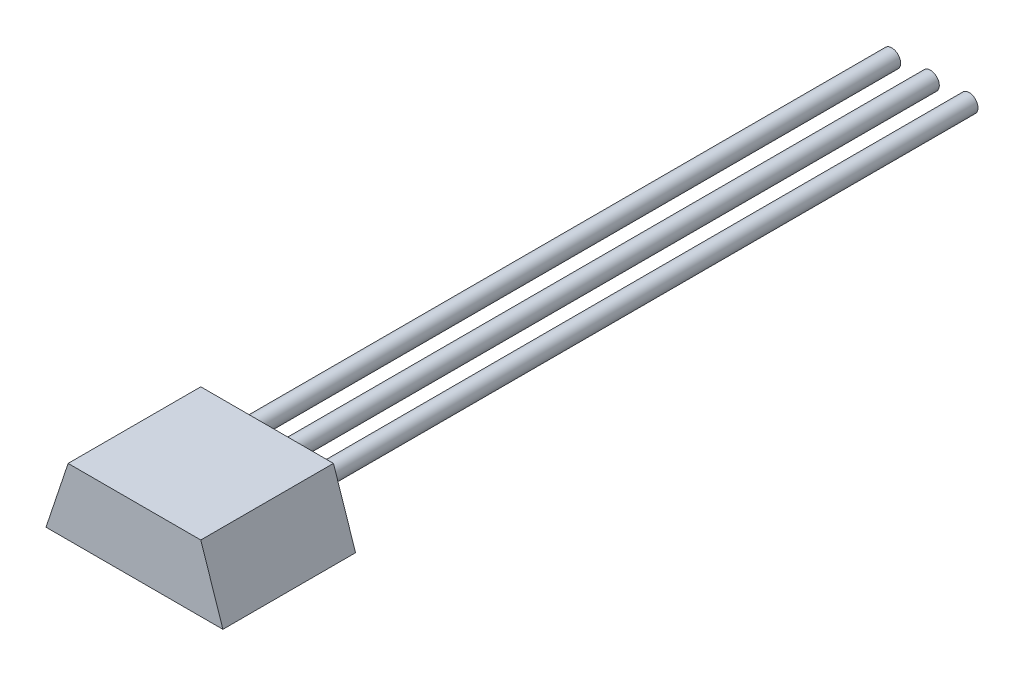
ISO-10303-21;
HEADER;
FILE_DESCRIPTION(('STEP AP214'),'2;1');
FILE_NAME('part.step','',(''),(''),'','','');
FILE_SCHEMA(('AUTOMOTIVE_DESIGN { 1 0 10303 214 1 1 1 1 }'));
ENDSEC;
DATA;
#1=APPLICATION_CONTEXT('core data for automotive mechanical design processes');
#2=APPLICATION_PROTOCOL_DEFINITION('international standard','automotive_design',2000,#1);
#3=PRODUCT_CONTEXT('',#1,'mechanical');
#4=PRODUCT('Part','Part','',(#3));
#5=PRODUCT_RELATED_PRODUCT_CATEGORY('part','',(#4));
#6=PRODUCT_DEFINITION_FORMATION('','',#4);
#7=PRODUCT_DEFINITION_CONTEXT('part definition',#1,'design');
#8=PRODUCT_DEFINITION('design','',#6,#7);
#9=PRODUCT_DEFINITION_SHAPE('','',#8);
#10=(LENGTH_UNIT() NAMED_UNIT(*) SI_UNIT(.MILLI.,.METRE.));
#11=(NAMED_UNIT(*) PLANE_ANGLE_UNIT() SI_UNIT($,.RADIAN.));
#12=(NAMED_UNIT(*) SI_UNIT($,.STERADIAN.) SOLID_ANGLE_UNIT());
#13=UNCERTAINTY_MEASURE_WITH_UNIT(LENGTH_MEASURE(1.E-05),#10,'distance_accuracy_value','');
#14=(GEOMETRIC_REPRESENTATION_CONTEXT(3) GLOBAL_UNCERTAINTY_ASSIGNED_CONTEXT((#13)) GLOBAL_UNIT_ASSIGNED_CONTEXT((#10,
#11,#12)) REPRESENTATION_CONTEXT('',''));
#15=CARTESIAN_POINT('',(0.,0.,0.));
#16=DIRECTION('',(0.,0.,1.));
#17=DIRECTION('',(1.,0.,0.));
#18=AXIS2_PLACEMENT_3D('',#15,#16,#17);
#19=CARTESIAN_POINT('',(-1.8,0.6,0.));
#20=DIRECTION('',(0.948683298050514,-0.316227766016838,0.));
#21=DIRECTION('',(0.316227766016838,0.948683298050514,0.));
#22=AXIS2_PLACEMENT_3D('',#19,#20,#21);
#23=PLANE('',#22);
#24=DIRECTION('',(0.,0.,1.));
#25=VECTOR('',#24,1.);
#26=CARTESIAN_POINT('',(-2.,0.,1.5));
#27=LINE('',#26,#25);
#28=CARTESIAN_POINT('',(-2.,0.,-1.5));
#29=VERTEX_POINT('',#28);
#30=CARTESIAN_POINT('',(-2.,0.,1.5));
#31=VERTEX_POINT('',#30);
#32=EDGE_CURVE('E91',#29,#31,#27,.T.);
#33=ORIENTED_EDGE('',*,*,#32,.T.);
#34=DIRECTION('',(-0.316227766016838,-0.948683298050514,0.));
#35=VECTOR('',#34,1.);
#36=CARTESIAN_POINT('',(-1.55,1.35,1.5));
#37=LINE('',#36,#35);
#38=CARTESIAN_POINT('',(-1.5,1.5,1.5));
#39=VERTEX_POINT('',#38);
#40=EDGE_CURVE('E81',#39,#31,#37,.T.);
#41=ORIENTED_EDGE('',*,*,#40,.F.);
#42=DIRECTION('',(0.,0.,1.));
#43=VECTOR('',#42,1.);
#44=CARTESIAN_POINT('',(-1.5,1.5,0.));
#45=LINE('',#44,#43);
#46=CARTESIAN_POINT('',(-1.5,1.5,-1.5));
#47=VERTEX_POINT('',#46);
#48=EDGE_CURVE('E107',#47,#39,#45,.T.);
#49=ORIENTED_EDGE('',*,*,#48,.F.);
#50=DIRECTION('',(0.316227766016838,0.948683298050514,0.));
#51=VECTOR('',#50,1.);
#52=CARTESIAN_POINT('',(-1.55,1.35,-1.5));
#53=LINE('',#52,#51);
#54=EDGE_CURVE('E58',#29,#47,#53,.T.);
#55=ORIENTED_EDGE('',*,*,#54,.F.);
#56=EDGE_LOOP('',(#33,#41,#49,#55));
#57=FACE_BOUND('',#56,.T.);
#58=ADVANCED_FACE('F35',(#57),#23,.F.);
#59=CARTESIAN_POINT('',(1.8,0.6,0.));
#60=DIRECTION('',(-0.948683298050514,-0.316227766016838,0.));
#61=DIRECTION('',(0.316227766016838,-0.948683298050514,0.));
#62=AXIS2_PLACEMENT_3D('',#59,#60,#61);
#63=PLANE('',#62);
#64=DIRECTION('',(-0.316227766016838,0.948683298050514,0.));
#65=VECTOR('',#64,1.);
#66=CARTESIAN_POINT('',(1.15,2.55,1.5));
#67=LINE('',#66,#65);
#68=CARTESIAN_POINT('',(2.,0.,1.5));
#69=VERTEX_POINT('',#68);
#70=CARTESIAN_POINT('',(1.5,1.5,1.5));
#71=VERTEX_POINT('',#70);
#72=EDGE_CURVE('E87',#69,#71,#67,.T.);
#73=ORIENTED_EDGE('',*,*,#72,.F.);
#74=DIRECTION('',(0.,0.,-1.));
#75=VECTOR('',#74,1.);
#76=CARTESIAN_POINT('',(2.,0.,1.5));
#77=LINE('',#76,#75);
#78=CARTESIAN_POINT('',(2.,0.,-1.5));
#79=VERTEX_POINT('',#78);
#80=EDGE_CURVE('E84',#69,#79,#77,.T.);
#81=ORIENTED_EDGE('',*,*,#80,.T.);
#82=DIRECTION('',(0.316227766016838,-0.948683298050514,0.));
#83=VECTOR('',#82,1.);
#84=CARTESIAN_POINT('',(1.15,2.55,-1.5));
#85=LINE('',#84,#83);
#86=CARTESIAN_POINT('',(1.5,1.5,-1.5));
#87=VERTEX_POINT('',#86);
#88=EDGE_CURVE('E75',#87,#79,#85,.T.);
#89=ORIENTED_EDGE('',*,*,#88,.F.);
#90=DIRECTION('',(0.,0.,-1.));
#91=VECTOR('',#90,1.);
#92=CARTESIAN_POINT('',(1.5,1.5,0.));
#93=LINE('',#92,#91);
#94=EDGE_CURVE('E50',#71,#87,#93,.T.);
#95=ORIENTED_EDGE('',*,*,#94,.F.);
#96=EDGE_LOOP('',(#73,#81,#89,#95));
#97=FACE_BOUND('',#96,.T.);
#98=ADVANCED_FACE('F85',(#97),#63,.F.);
#99=CARTESIAN_POINT('',(-2.,1.5,-1.5));
#100=DIRECTION('',(0.,0.,1.));
#101=DIRECTION('',(1.,0.,0.));
#102=AXIS2_PLACEMENT_3D('',#99,#100,#101);
#103=PLANE('',#102);
#104=CARTESIAN_POINT('',(0.875,0.75,-1.5));
#105=DIRECTION('',(0.,0.,1.));
#106=DIRECTION('',(1.,0.,0.));
#107=AXIS2_PLACEMENT_3D('',#104,#105,#106);
#108=CIRCLE('',#107,0.2);
#109=CARTESIAN_POINT('',(1.075,0.75,-1.5));
#110=VERTEX_POINT('',#109);
#111=EDGE_CURVE('E11',#110,#110,#108,.F.);
#112=ORIENTED_EDGE('',*,*,#111,.F.);
#113=EDGE_LOOP('',(#112));
#114=FACE_BOUND('',#113,.T.);
#115=CARTESIAN_POINT('',(0.,0.75,-1.5));
#116=DIRECTION('',(0.,0.,1.));
#117=DIRECTION('',(1.,0.,0.));
#118=AXIS2_PLACEMENT_3D('',#115,#116,#117);
#119=CIRCLE('',#118,0.2);
#120=CARTESIAN_POINT('',(0.2,0.75,-1.5));
#121=VERTEX_POINT('',#120);
#122=EDGE_CURVE('E43',#121,#121,#119,.F.);
#123=ORIENTED_EDGE('',*,*,#122,.F.);
#124=EDGE_LOOP('',(#123));
#125=FACE_BOUND('',#124,.T.);
#126=CARTESIAN_POINT('',(-0.875,0.75,-1.5));
#127=DIRECTION('',(0.,0.,1.));
#128=DIRECTION('',(1.,0.,0.));
#129=AXIS2_PLACEMENT_3D('',#126,#127,#128);
#130=CIRCLE('',#129,0.2);
#131=CARTESIAN_POINT('',(-0.675,0.75,-1.5));
#132=VERTEX_POINT('',#131);
#133=EDGE_CURVE('E97',#132,#132,#130,.F.);
#134=ORIENTED_EDGE('',*,*,#133,.F.);
#135=EDGE_LOOP('',(#134));
#136=FACE_BOUND('',#135,.T.);
#137=DIRECTION('',(-1.,0.,0.));
#138=VECTOR('',#137,1.);
#139=CARTESIAN_POINT('',(-2.,0.,-1.5));
#140=LINE('',#139,#138);
#141=EDGE_CURVE('E78',#79,#29,#140,.T.);
#142=ORIENTED_EDGE('',*,*,#141,.T.);
#143=ORIENTED_EDGE('',*,*,#54,.T.);
#144=DIRECTION('',(-1.,0.,0.));
#145=VECTOR('',#144,1.);
#146=CARTESIAN_POINT('',(-2.,1.5,-1.5));
#147=LINE('',#146,#145);
#148=EDGE_CURVE('E79',#87,#47,#147,.T.);
#149=ORIENTED_EDGE('',*,*,#148,.F.);
#150=ORIENTED_EDGE('',*,*,#88,.T.);
#151=EDGE_LOOP('',(#142,#143,#149,#150));
#152=FACE_BOUND('',#151,.T.);
#153=ADVANCED_FACE('F37',(#114,#125,#136,#152),#103,.F.);
#154=CARTESIAN_POINT('',(-2.,1.5,1.5));
#155=DIRECTION('',(0.,0.,-1.));
#156=DIRECTION('',(-1.,0.,0.));
#157=AXIS2_PLACEMENT_3D('',#154,#155,#156);
#158=PLANE('',#157);
#159=DIRECTION('',(1.,0.,0.));
#160=VECTOR('',#159,1.);
#161=CARTESIAN_POINT('',(-2.,1.5,1.5));
#162=LINE('',#161,#160);
#163=EDGE_CURVE('E106',#39,#71,#162,.T.);
#164=ORIENTED_EDGE('',*,*,#163,.F.);
#165=ORIENTED_EDGE('',*,*,#40,.T.);
#166=DIRECTION('',(1.,0.,0.));
#167=VECTOR('',#166,1.);
#168=CARTESIAN_POINT('',(-2.,0.,1.5));
#169=LINE('',#168,#167);
#170=EDGE_CURVE('E98',#31,#69,#169,.T.);
#171=ORIENTED_EDGE('',*,*,#170,.T.);
#172=ORIENTED_EDGE('',*,*,#72,.T.);
#173=EDGE_LOOP('',(#164,#165,#171,#172));
#174=FACE_BOUND('',#173,.T.);
#175=ADVANCED_FACE('F118',(#174),#158,.F.);
#176=CARTESIAN_POINT('',(0.,0.,0.));
#177=DIRECTION('',(0.,-1.,0.));
#178=DIRECTION('',(0.,0.,-1.));
#179=AXIS2_PLACEMENT_3D('',#176,#177,#178);
#180=PLANE('',#179);
#181=ORIENTED_EDGE('',*,*,#80,.F.);
#182=ORIENTED_EDGE('',*,*,#170,.F.);
#183=ORIENTED_EDGE('',*,*,#32,.F.);
#184=ORIENTED_EDGE('',*,*,#141,.F.);
#185=EDGE_LOOP('',(#181,#182,#183,#184));
#186=FACE_BOUND('',#185,.T.);
#187=ADVANCED_FACE('F95',(#186),#180,.T.);
#188=CARTESIAN_POINT('',(0.,1.5,0.));
#189=DIRECTION('',(0.,-1.,0.));
#190=DIRECTION('',(0.,0.,-1.));
#191=AXIS2_PLACEMENT_3D('',#188,#189,#190);
#192=PLANE('',#191);
#193=ORIENTED_EDGE('',*,*,#148,.T.);
#194=ORIENTED_EDGE('',*,*,#48,.T.);
#195=ORIENTED_EDGE('',*,*,#163,.T.);
#196=ORIENTED_EDGE('',*,*,#94,.T.);
#197=EDGE_LOOP('',(#193,#194,#195,#196));
#198=FACE_BOUND('',#197,.T.);
#199=ADVANCED_FACE('F125',(#198),#192,.F.);
#200=CARTESIAN_POINT('',(-0.875,0.75,-16.5));
#201=DIRECTION('',(0.,0.,1.));
#202=DIRECTION('',(1.,0.,0.));
#203=AXIS2_PLACEMENT_3D('',#200,#201,#202);
#204=CYLINDRICAL_SURFACE('',#203,0.2);
#205=CARTESIAN_POINT('',(-0.875,0.75,-16.5));
#206=DIRECTION('',(0.,0.,-1.));
#207=DIRECTION('',(-1.,0.,0.));
#208=AXIS2_PLACEMENT_3D('',#205,#206,#207);
#209=CIRCLE('',#208,0.2);
#210=CARTESIAN_POINT('',(-1.075,0.75,-16.5));
#211=VERTEX_POINT('',#210);
#212=EDGE_CURVE('E92',#211,#211,#209,.T.);
#213=ORIENTED_EDGE('',*,*,#212,.F.);
#214=EDGE_LOOP('',(#213));
#215=FACE_BOUND('',#214,.T.);
#216=ORIENTED_EDGE('',*,*,#133,.T.);
#217=EDGE_LOOP('',(#216));
#218=FACE_BOUND('',#217,.T.);
#219=ADVANCED_FACE('F120',(#215,#218),#204,.T.);
#220=CARTESIAN_POINT('',(-0.875,0.75,-16.5));
#221=DIRECTION('',(0.,0.,-1.));
#222=DIRECTION('',(-1.,0.,0.));
#223=AXIS2_PLACEMENT_3D('',#220,#221,#222);
#224=PLANE('',#223);
#225=ORIENTED_EDGE('',*,*,#212,.T.);
#226=EDGE_LOOP('',(#225));
#227=FACE_BOUND('',#226,.T.);
#228=ADVANCED_FACE('F124',(#227),#224,.T.);
#229=CARTESIAN_POINT('',(0.,0.75,-16.5));
#230=DIRECTION('',(0.,0.,1.));
#231=DIRECTION('',(1.,0.,0.));
#232=AXIS2_PLACEMENT_3D('',#229,#230,#231);
#233=CYLINDRICAL_SURFACE('',#232,0.2);
#234=CARTESIAN_POINT('',(0.,0.75,-16.5));
#235=DIRECTION('',(0.,0.,-1.));
#236=DIRECTION('',(-1.,0.,0.));
#237=AXIS2_PLACEMENT_3D('',#234,#235,#236);
#238=CIRCLE('',#237,0.2);
#239=CARTESIAN_POINT('',(-0.2,0.75,-16.5));
#240=VERTEX_POINT('',#239);
#241=EDGE_CURVE('E156',#240,#240,#238,.T.);
#242=ORIENTED_EDGE('',*,*,#241,.F.);
#243=EDGE_LOOP('',(#242));
#244=FACE_BOUND('',#243,.T.);
#245=ORIENTED_EDGE('',*,*,#122,.T.);
#246=EDGE_LOOP('',(#245));
#247=FACE_BOUND('',#246,.T.);
#248=ADVANCED_FACE('F114',(#244,#247),#233,.T.);
#249=CARTESIAN_POINT('',(0.,0.75,-16.5));
#250=DIRECTION('',(0.,0.,-1.));
#251=DIRECTION('',(-1.,0.,0.));
#252=AXIS2_PLACEMENT_3D('',#249,#250,#251);
#253=PLANE('',#252);
#254=ORIENTED_EDGE('',*,*,#241,.T.);
#255=EDGE_LOOP('',(#254));
#256=FACE_BOUND('',#255,.T.);
#257=ADVANCED_FACE('F168',(#256),#253,.T.);
#258=CARTESIAN_POINT('',(0.875,0.75,-16.5));
#259=DIRECTION('',(0.,0.,1.));
#260=DIRECTION('',(1.,0.,0.));
#261=AXIS2_PLACEMENT_3D('',#258,#259,#260);
#262=CYLINDRICAL_SURFACE('',#261,0.2);
#263=CARTESIAN_POINT('',(0.875,0.75,-16.5));
#264=DIRECTION('',(0.,0.,-1.));
#265=DIRECTION('',(-1.,0.,0.));
#266=AXIS2_PLACEMENT_3D('',#263,#264,#265);
#267=CIRCLE('',#266,0.2);
#268=CARTESIAN_POINT('',(0.675,0.75,-16.5));
#269=VERTEX_POINT('',#268);
#270=EDGE_CURVE('E159',#269,#269,#267,.T.);
#271=ORIENTED_EDGE('',*,*,#270,.F.);
#272=EDGE_LOOP('',(#271));
#273=FACE_BOUND('',#272,.T.);
#274=ORIENTED_EDGE('',*,*,#111,.T.);
#275=EDGE_LOOP('',(#274));
#276=FACE_BOUND('',#275,.T.);
#277=ADVANCED_FACE('F165',(#273,#276),#262,.T.);
#278=CARTESIAN_POINT('',(0.875,0.75,-16.5));
#279=DIRECTION('',(0.,0.,-1.));
#280=DIRECTION('',(-1.,0.,0.));
#281=AXIS2_PLACEMENT_3D('',#278,#279,#280);
#282=PLANE('',#281);
#283=ORIENTED_EDGE('',*,*,#270,.T.);
#284=EDGE_LOOP('',(#283));
#285=FACE_BOUND('',#284,.T.);
#286=ADVANCED_FACE('F163',(#285),#282,.T.);
#287=CLOSED_SHELL('',(#58,#98,#153,#175,#187,#199,#219,#228,#248,#257,#277,#286));
#288=MANIFOLD_SOLID_BREP('B2',#287);
#289=ADVANCED_BREP_SHAPE_REPRESENTATION('',(#18,#288),#14);
#290=SHAPE_DEFINITION_REPRESENTATION(#9,#289);
ENDSEC;
END-ISO-10303-21;
